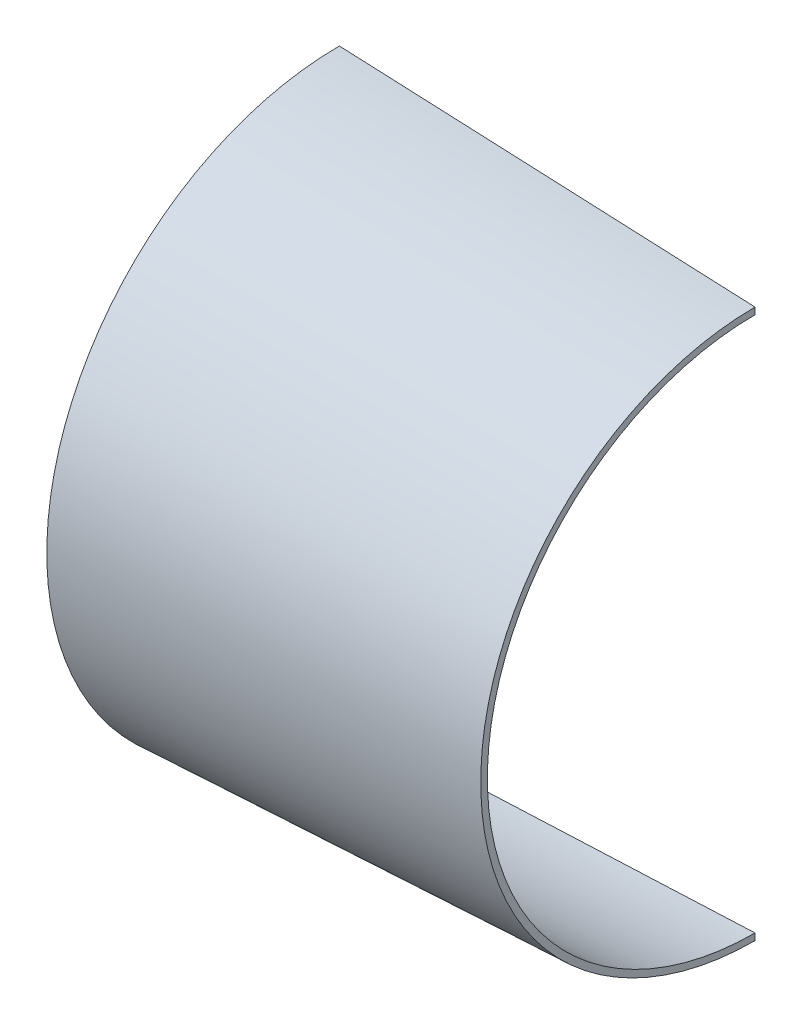
ISO-10303-21;
HEADER;
FILE_DESCRIPTION(('STEP AP214'),'2;1');
FILE_NAME('part.step','',(''),(''),'','','');
FILE_SCHEMA(('AUTOMOTIVE_DESIGN { 1 0 10303 214 1 1 1 1 }'));
ENDSEC;
DATA;
#1=APPLICATION_CONTEXT('core data for automotive mechanical design processes');
#2=APPLICATION_PROTOCOL_DEFINITION('international standard','automotive_design',2000,#1);
#3=PRODUCT_CONTEXT('',#1,'mechanical');
#4=PRODUCT('Part','Part','',(#3));
#5=PRODUCT_RELATED_PRODUCT_CATEGORY('part','',(#4));
#6=PRODUCT_DEFINITION_FORMATION('','',#4);
#7=PRODUCT_DEFINITION_CONTEXT('part definition',#1,'design');
#8=PRODUCT_DEFINITION('design','',#6,#7);
#9=PRODUCT_DEFINITION_SHAPE('','',#8);
#10=(LENGTH_UNIT() NAMED_UNIT(*) SI_UNIT(.MILLI.,.METRE.));
#11=(NAMED_UNIT(*) PLANE_ANGLE_UNIT() SI_UNIT($,.RADIAN.));
#12=(NAMED_UNIT(*) SI_UNIT($,.STERADIAN.) SOLID_ANGLE_UNIT());
#13=UNCERTAINTY_MEASURE_WITH_UNIT(LENGTH_MEASURE(1.E-05),#10,'distance_accuracy_value','');
#14=(GEOMETRIC_REPRESENTATION_CONTEXT(3) GLOBAL_UNCERTAINTY_ASSIGNED_CONTEXT((#13)) GLOBAL_UNIT_ASSIGNED_CONTEXT((#10,
#11,#12)) REPRESENTATION_CONTEXT('',''));
#15=CARTESIAN_POINT('',(0.,0.,0.));
#16=DIRECTION('',(0.,0.,1.));
#17=DIRECTION('',(1.,0.,0.));
#18=AXIS2_PLACEMENT_3D('',#15,#16,#17);
#19=CARTESIAN_POINT('',(700.,0.,0.));
#20=DIRECTION('',(-1.,0.,0.));
#21=DIRECTION('',(0.,0.,1.));
#22=AXIS2_PLACEMENT_3D('',#19,#20,#21);
#23=CONICAL_SURFACE('',#22,1720.,0.0439716382710355);
#24=CARTESIAN_POINT('',(700.,0.,0.));
#25=DIRECTION('',(-1.,0.,0.));
#26=DIRECTION('',(0.,0.,1.));
#27=AXIS2_PLACEMENT_3D('',#24,#25,#26);
#28=CIRCLE('',#27,1720.);
#29=CARTESIAN_POINT('',(700.,-1720.,9.21744442524985E-05));
#30=VERTEX_POINT('',#29);
#31=CARTESIAN_POINT('',(700.,1720.,0.));
#32=VERTEX_POINT('',#31);
#33=EDGE_CURVE('E11',#30,#32,#28,.T.);
#34=ORIENTED_EDGE('',*,*,#33,.T.);
#35=DIRECTION('',(0.999033403272237,-0.0439574697439784,0.));
#36=VECTOR('',#35,1.);
#37=CARTESIAN_POINT('',(3200.,1610.,0.));
#38=LINE('',#37,#36);
#39=CARTESIAN_POINT('',(3200.,1610.,0.));
#40=VERTEX_POINT('',#39);
#41=EDGE_CURVE('E100',#32,#40,#38,.T.);
#42=ORIENTED_EDGE('',*,*,#41,.T.);
#43=CARTESIAN_POINT('',(3200.,0.,0.));
#44=DIRECTION('',(-1.,0.,0.));
#45=DIRECTION('',(0.,0.,1.));
#46=AXIS2_PLACEMENT_3D('',#43,#44,#45);
#47=CIRCLE('',#46,1610.);
#48=CARTESIAN_POINT('',(3200.,-1610.,8.62795670037922E-05));
#49=VERTEX_POINT('',#48);
#50=EDGE_CURVE('E80',#49,#40,#47,.T.);
#51=ORIENTED_EDGE('',*,*,#50,.F.);
#52=DIRECTION('',(0.999033403272237,0.0439574697439783,-2.35567171185885E-09));
#53=VECTOR('',#52,1.);
#54=CARTESIAN_POINT('',(3200.,-1610.,8.62795670037922E-05));
#55=LINE('',#54,#53);
#56=EDGE_CURVE('E103',#30,#49,#55,.T.);
#57=ORIENTED_EDGE('',*,*,#56,.F.);
#58=EDGE_LOOP('',(#34,#42,#51,#57));
#59=FACE_BOUND('',#58,.T.);
#60=ADVANCED_FACE('F39',(#59),#23,.F.);
#61=CARTESIAN_POINT('',(700.,-1720.,9.21744442524985E-05));
#62=DIRECTION('',(1.,0.,0.));
#63=DIRECTION('',(0.,0.,-1.));
#64=AXIS2_PLACEMENT_3D('',#61,#62,#63);
#65=PLANE('',#64);
#66=CARTESIAN_POINT('',(700.,0.,0.));
#67=DIRECTION('',(-1.,0.,0.));
#68=DIRECTION('',(0.,0.,1.));
#69=AXIS2_PLACEMENT_3D('',#66,#67,#68);
#70=CIRCLE('',#69,1760.);
#71=CARTESIAN_POINT('',(700.,-1760.,9.43180359793007E-05));
#72=VERTEX_POINT('',#71);
#73=CARTESIAN_POINT('',(700.,1760.,0.));
#74=VERTEX_POINT('',#73);
#75=EDGE_CURVE('E50',#72,#74,#70,.T.);
#76=ORIENTED_EDGE('',*,*,#75,.T.);
#77=DIRECTION('',(0.,-1.,0.));
#78=VECTOR('',#77,1.);
#79=CARTESIAN_POINT('',(700.,1720.,0.));
#80=LINE('',#79,#78);
#81=EDGE_CURVE('E104',#74,#32,#80,.T.);
#82=ORIENTED_EDGE('',*,*,#81,.T.);
#83=ORIENTED_EDGE('',*,*,#33,.F.);
#84=DIRECTION('',(0.,0.999999999999999,-5.35897931700572E-08));
#85=VECTOR('',#84,1.);
#86=CARTESIAN_POINT('',(700.,-1720.,9.21744442524985E-05));
#87=LINE('',#86,#85);
#88=EDGE_CURVE('E91',#72,#30,#87,.T.);
#89=ORIENTED_EDGE('',*,*,#88,.F.);
#90=EDGE_LOOP('',(#76,#82,#83,#89));
#91=FACE_BOUND('',#90,.T.);
#92=ADVANCED_FACE('F41',(#91),#65,.F.);
#93=CARTESIAN_POINT('',(3200.,0.,0.));
#94=DIRECTION('',(-1.,0.,0.));
#95=DIRECTION('',(0.,0.,1.));
#96=AXIS2_PLACEMENT_3D('',#93,#94,#95);
#97=CONICAL_SURFACE('',#96,1650.,0.0439716382710356);
#98=CARTESIAN_POINT('',(3200.,0.,0.));
#99=DIRECTION('',(-1.,0.,0.));
#100=DIRECTION('',(0.,0.,1.));
#101=AXIS2_PLACEMENT_3D('',#98,#99,#100);
#102=CIRCLE('',#101,1650.);
#103=CARTESIAN_POINT('',(3200.,-1650.,8.84231587305945E-05));
#104=VERTEX_POINT('',#103);
#105=CARTESIAN_POINT('',(3200.,1650.,0.));
#106=VERTEX_POINT('',#105);
#107=EDGE_CURVE('E89',#104,#106,#102,.T.);
#108=ORIENTED_EDGE('',*,*,#107,.T.);
#109=DIRECTION('',(-0.999033403272237,0.0439574697439784,0.));
#110=VECTOR('',#109,1.);
#111=CARTESIAN_POINT('',(700.,1760.,0.));
#112=LINE('',#111,#110);
#113=EDGE_CURVE('E97',#106,#74,#112,.T.);
#114=ORIENTED_EDGE('',*,*,#113,.T.);
#115=ORIENTED_EDGE('',*,*,#75,.F.);
#116=DIRECTION('',(-0.999033403272237,-0.0439574697439784,2.35567171185885E-09));
#117=VECTOR('',#116,1.);
#118=CARTESIAN_POINT('',(700.,-1760.,9.43180359793007E-05));
#119=LINE('',#118,#117);
#120=EDGE_CURVE('E109',#104,#72,#119,.T.);
#121=ORIENTED_EDGE('',*,*,#120,.F.);
#122=EDGE_LOOP('',(#108,#114,#115,#121));
#123=FACE_BOUND('',#122,.T.);
#124=ADVANCED_FACE('F112',(#123),#97,.T.);
#125=CARTESIAN_POINT('',(3200.,-1650.,8.84231587305945E-05));
#126=DIRECTION('',(-1.,0.,0.));
#127=DIRECTION('',(0.,0.,1.));
#128=AXIS2_PLACEMENT_3D('',#125,#126,#127);
#129=PLANE('',#128);
#130=DIRECTION('',(0.,-0.999999999999999,5.35897931700572E-08));
#131=VECTOR('',#130,1.);
#132=CARTESIAN_POINT('',(3200.,-1650.,8.84231587305945E-05));
#133=LINE('',#132,#131);
#134=EDGE_CURVE('E82',#49,#104,#133,.T.);
#135=ORIENTED_EDGE('',*,*,#134,.F.);
#136=ORIENTED_EDGE('',*,*,#50,.T.);
#137=DIRECTION('',(0.,1.,0.));
#138=VECTOR('',#137,1.);
#139=CARTESIAN_POINT('',(3200.,1650.,0.));
#140=LINE('',#139,#138);
#141=EDGE_CURVE('E85',#40,#106,#140,.T.);
#142=ORIENTED_EDGE('',*,*,#141,.T.);
#143=ORIENTED_EDGE('',*,*,#107,.F.);
#144=EDGE_LOOP('',(#135,#136,#142,#143));
#145=FACE_BOUND('',#144,.T.);
#146=ADVANCED_FACE('F83',(#145),#129,.F.);
#147=CARTESIAN_POINT('',(0.,0.,0.));
#148=DIRECTION('',(0.,5.35897931700572E-08,0.999999999999999));
#149=DIRECTION('',(-1.,0.,0.));
#150=AXIS2_PLACEMENT_3D('',#147,#148,#149);
#151=PLANE('',#150);
#152=ORIENTED_EDGE('',*,*,#56,.T.);
#153=ORIENTED_EDGE('',*,*,#134,.T.);
#154=ORIENTED_EDGE('',*,*,#120,.T.);
#155=ORIENTED_EDGE('',*,*,#88,.T.);
#156=EDGE_LOOP('',(#152,#153,#154,#155));
#157=FACE_BOUND('',#156,.T.);
#158=ADVANCED_FACE('F111',(#157),#151,.F.);
#159=CARTESIAN_POINT('',(0.,0.,0.));
#160=DIRECTION('',(0.,0.,-1.));
#161=DIRECTION('',(-1.,0.,0.));
#162=AXIS2_PLACEMENT_3D('',#159,#160,#161);
#163=PLANE('',#162);
#164=ORIENTED_EDGE('',*,*,#41,.F.);
#165=ORIENTED_EDGE('',*,*,#81,.F.);
#166=ORIENTED_EDGE('',*,*,#113,.F.);
#167=ORIENTED_EDGE('',*,*,#141,.F.);
#168=EDGE_LOOP('',(#164,#165,#166,#167));
#169=FACE_BOUND('',#168,.T.);
#170=ADVANCED_FACE('F94',(#169),#163,.T.);
#171=CLOSED_SHELL('',(#60,#92,#124,#146,#158,#170));
#172=MANIFOLD_SOLID_BREP('B2',#171);
#173=ADVANCED_BREP_SHAPE_REPRESENTATION('',(#18,#172),#14);
#174=SHAPE_DEFINITION_REPRESENTATION(#9,#173);
ENDSEC;
END-ISO-10303-21;
